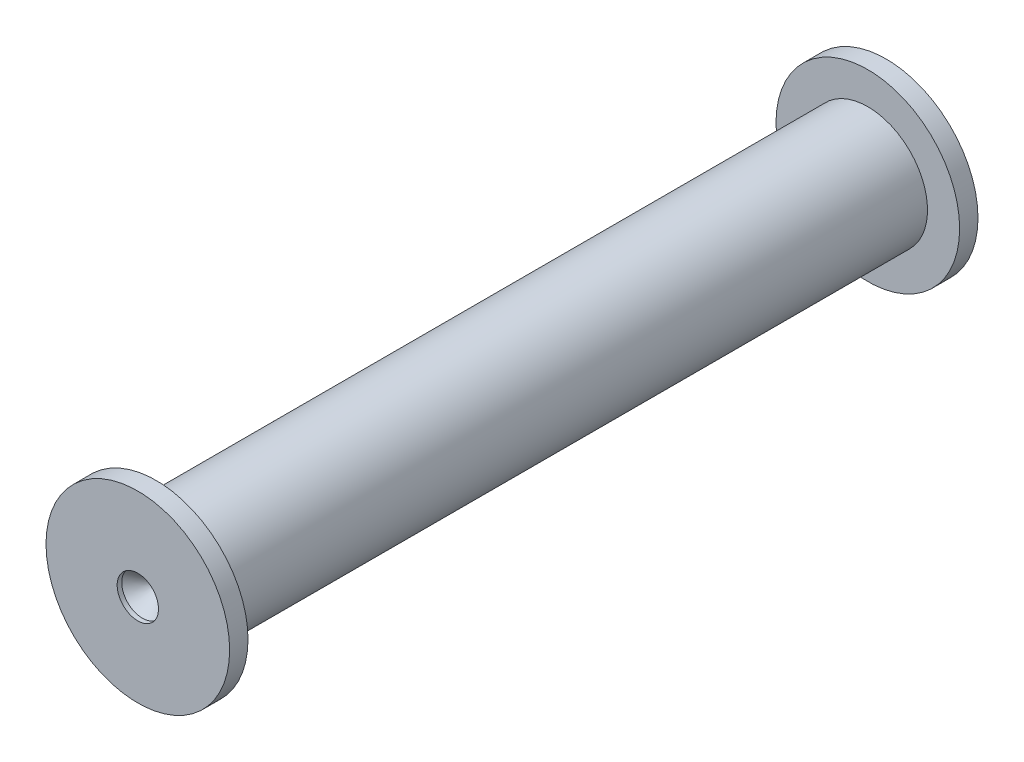
ISO-10303-21;
HEADER;
FILE_DESCRIPTION(('STEP AP214'),'2;1');
FILE_NAME('part.step','',(''),(''),'','','');
FILE_SCHEMA(('AUTOMOTIVE_DESIGN { 1 0 10303 214 1 1 1 1 }'));
ENDSEC;
DATA;
#1=APPLICATION_CONTEXT('core data for automotive mechanical design processes');
#2=APPLICATION_PROTOCOL_DEFINITION('international standard','automotive_design',2000,#1);
#3=PRODUCT_CONTEXT('',#1,'mechanical');
#4=PRODUCT('Part','Part','',(#3));
#5=PRODUCT_RELATED_PRODUCT_CATEGORY('part','',(#4));
#6=PRODUCT_DEFINITION_FORMATION('','',#4);
#7=PRODUCT_DEFINITION_CONTEXT('part definition',#1,'design');
#8=PRODUCT_DEFINITION('design','',#6,#7);
#9=PRODUCT_DEFINITION_SHAPE('','',#8);
#10=(LENGTH_UNIT() NAMED_UNIT(*) SI_UNIT(.MILLI.,.METRE.));
#11=(NAMED_UNIT(*) PLANE_ANGLE_UNIT() SI_UNIT($,.RADIAN.));
#12=(NAMED_UNIT(*) SI_UNIT($,.STERADIAN.) SOLID_ANGLE_UNIT());
#13=UNCERTAINTY_MEASURE_WITH_UNIT(LENGTH_MEASURE(1.E-05),#10,'distance_accuracy_value','');
#14=(GEOMETRIC_REPRESENTATION_CONTEXT(3) GLOBAL_UNCERTAINTY_ASSIGNED_CONTEXT((#13)) GLOBAL_UNIT_ASSIGNED_CONTEXT((#10,
#11,#12)) REPRESENTATION_CONTEXT('',''));
#15=CARTESIAN_POINT('',(0.,0.,0.));
#16=DIRECTION('',(0.,0.,1.));
#17=DIRECTION('',(1.,0.,0.));
#18=AXIS2_PLACEMENT_3D('',#15,#16,#17);
#19=CARTESIAN_POINT('',(3.3,-31.2819394424174,0.1));
#20=DIRECTION('',(0.,0.,-1.));
#21=DIRECTION('',(-1.,0.,0.));
#22=AXIS2_PLACEMENT_3D('',#19,#20,#21);
#23=CYLINDRICAL_SURFACE('',#22,1.3);
#24=CARTESIAN_POINT('',(3.3,-31.2819394424174,0.1));
#25=DIRECTION('',(0.,0.,1.));
#26=DIRECTION('',(1.,0.,0.));
#27=AXIS2_PLACEMENT_3D('',#24,#25,#26);
#28=CIRCLE('',#27,1.3);
#29=CARTESIAN_POINT('',(4.6,-31.2819394424174,0.1));
#30=VERTEX_POINT('',#29);
#31=EDGE_CURVE('E62',#30,#30,#28,.T.);
#32=ORIENTED_EDGE('',*,*,#31,.F.);
#33=EDGE_LOOP('',(#32));
#34=FACE_BOUND('',#33,.T.);
#35=CARTESIAN_POINT('',(3.3,-31.2819394424174,-15.4));
#36=DIRECTION('',(0.,0.,-1.));
#37=DIRECTION('',(-1.,0.,0.));
#38=AXIS2_PLACEMENT_3D('',#35,#36,#37);
#39=CIRCLE('',#38,1.3);
#40=CARTESIAN_POINT('',(2.,-31.2819394424174,-15.4));
#41=VERTEX_POINT('',#40);
#42=EDGE_CURVE('E69',#41,#41,#39,.T.);
#43=ORIENTED_EDGE('',*,*,#42,.F.);
#44=EDGE_LOOP('',(#43));
#45=FACE_BOUND('',#44,.T.);
#46=ADVANCED_FACE('F42',(#34,#45),#23,.T.);
#47=CARTESIAN_POINT('',(3.3,-31.2819394424174,0.1));
#48=DIRECTION('',(0.,0.,1.));
#49=DIRECTION('',(1.,0.,0.));
#50=AXIS2_PLACEMENT_3D('',#47,#48,#49);
#51=PLANE('',#50);
#52=CARTESIAN_POINT('',(3.3,-31.2819394424174,0.1));
#53=DIRECTION('',(0.,0.,1.));
#54=DIRECTION('',(1.,0.,0.));
#55=AXIS2_PLACEMENT_3D('',#52,#53,#54);
#56=CIRCLE('',#55,2.);
#57=CARTESIAN_POINT('',(5.3,-31.2819394424174,0.1));
#58=VERTEX_POINT('',#57);
#59=EDGE_CURVE('E66',#58,#58,#56,.T.);
#60=ORIENTED_EDGE('',*,*,#59,.F.);
#61=EDGE_LOOP('',(#60));
#62=FACE_BOUND('',#61,.T.);
#63=ORIENTED_EDGE('',*,*,#31,.T.);
#64=EDGE_LOOP('',(#63));
#65=FACE_BOUND('',#64,.T.);
#66=ADVANCED_FACE('F99',(#62,#65),#51,.F.);
#67=CARTESIAN_POINT('',(3.3,-31.2819394424174,0.5));
#68=DIRECTION('',(0.,0.,-1.));
#69=DIRECTION('',(-1.,0.,0.));
#70=AXIS2_PLACEMENT_3D('',#67,#68,#69);
#71=CYLINDRICAL_SURFACE('',#70,2.);
#72=CARTESIAN_POINT('',(3.3,-31.2819394424174,0.5));
#73=DIRECTION('',(0.,0.,1.));
#74=DIRECTION('',(1.,0.,0.));
#75=AXIS2_PLACEMENT_3D('',#72,#73,#74);
#76=CIRCLE('',#75,2.);
#77=CARTESIAN_POINT('',(5.3,-31.2819394424174,0.5));
#78=VERTEX_POINT('',#77);
#79=EDGE_CURVE('E65',#78,#78,#76,.T.);
#80=ORIENTED_EDGE('',*,*,#79,.F.);
#81=EDGE_LOOP('',(#80));
#82=FACE_BOUND('',#81,.T.);
#83=ORIENTED_EDGE('',*,*,#59,.T.);
#84=EDGE_LOOP('',(#83));
#85=FACE_BOUND('',#84,.T.);
#86=ADVANCED_FACE('F93',(#82,#85),#71,.T.);
#87=CARTESIAN_POINT('',(3.3,-31.2819394424174,0.5));
#88=DIRECTION('',(0.,0.,1.));
#89=DIRECTION('',(1.,0.,0.));
#90=AXIS2_PLACEMENT_3D('',#87,#88,#89);
#91=PLANE('',#90);
#92=CARTESIAN_POINT('',(3.3,-31.2819394424174,0.5));
#93=DIRECTION('',(0.,0.,1.));
#94=DIRECTION('',(1.,0.,0.));
#95=AXIS2_PLACEMENT_3D('',#92,#93,#94);
#96=CIRCLE('',#95,0.449999999999999);
#97=CARTESIAN_POINT('',(3.75,-31.2819394424174,0.5));
#98=VERTEX_POINT('',#97);
#99=EDGE_CURVE('E83',#98,#98,#96,.T.);
#100=ORIENTED_EDGE('',*,*,#99,.F.);
#101=EDGE_LOOP('',(#100));
#102=FACE_BOUND('',#101,.T.);
#103=ORIENTED_EDGE('',*,*,#79,.T.);
#104=EDGE_LOOP('',(#103));
#105=FACE_BOUND('',#104,.T.);
#106=ADVANCED_FACE('F89',(#102,#105),#91,.T.);
#107=CARTESIAN_POINT('',(3.3,-31.2819394424174,-15.4));
#108=DIRECTION('',(0.,0.,-1.));
#109=DIRECTION('',(-1.,0.,0.));
#110=AXIS2_PLACEMENT_3D('',#107,#108,#109);
#111=PLANE('',#110);
#112=CARTESIAN_POINT('',(3.3,-31.2819394424174,-15.4));
#113=DIRECTION('',(0.,0.,-1.));
#114=DIRECTION('',(-1.,0.,0.));
#115=AXIS2_PLACEMENT_3D('',#112,#113,#114);
#116=CIRCLE('',#115,2.);
#117=CARTESIAN_POINT('',(1.3,-31.2819394424174,-15.4));
#118=VERTEX_POINT('',#117);
#119=EDGE_CURVE('E75',#118,#118,#116,.T.);
#120=ORIENTED_EDGE('',*,*,#119,.F.);
#121=EDGE_LOOP('',(#120));
#122=FACE_BOUND('',#121,.T.);
#123=ORIENTED_EDGE('',*,*,#42,.T.);
#124=EDGE_LOOP('',(#123));
#125=FACE_BOUND('',#124,.T.);
#126=ADVANCED_FACE('F92',(#122,#125),#111,.F.);
#127=CARTESIAN_POINT('',(3.3,-31.2819394424174,-15.8));
#128=DIRECTION('',(0.,0.,1.));
#129=DIRECTION('',(1.,0.,0.));
#130=AXIS2_PLACEMENT_3D('',#127,#128,#129);
#131=CYLINDRICAL_SURFACE('',#130,2.);
#132=CARTESIAN_POINT('',(3.3,-31.2819394424174,-15.8));
#133=DIRECTION('',(0.,0.,-1.));
#134=DIRECTION('',(-1.,0.,0.));
#135=AXIS2_PLACEMENT_3D('',#132,#133,#134);
#136=CIRCLE('',#135,2.);
#137=CARTESIAN_POINT('',(1.3,-31.2819394424174,-15.8));
#138=VERTEX_POINT('',#137);
#139=EDGE_CURVE('E74',#138,#138,#136,.T.);
#140=ORIENTED_EDGE('',*,*,#139,.F.);
#141=EDGE_LOOP('',(#140));
#142=FACE_BOUND('',#141,.T.);
#143=ORIENTED_EDGE('',*,*,#119,.T.);
#144=EDGE_LOOP('',(#143));
#145=FACE_BOUND('',#144,.T.);
#146=ADVANCED_FACE('F114',(#142,#145),#131,.T.);
#147=CARTESIAN_POINT('',(3.3,-31.2819394424174,-15.8));
#148=DIRECTION('',(0.,0.,-1.));
#149=DIRECTION('',(-1.,0.,0.));
#150=AXIS2_PLACEMENT_3D('',#147,#148,#149);
#151=PLANE('',#150);
#152=CARTESIAN_POINT('',(3.3,-31.2819394424174,-15.8));
#153=DIRECTION('',(0.,0.,-1.));
#154=DIRECTION('',(-1.,0.,0.));
#155=AXIS2_PLACEMENT_3D('',#152,#153,#154);
#156=CIRCLE('',#155,0.449999999999999);
#157=CARTESIAN_POINT('',(2.85,-31.2819394424174,-15.8));
#158=VERTEX_POINT('',#157);
#159=EDGE_CURVE('E78',#158,#158,#156,.T.);
#160=ORIENTED_EDGE('',*,*,#159,.F.);
#161=EDGE_LOOP('',(#160));
#162=FACE_BOUND('',#161,.T.);
#163=ORIENTED_EDGE('',*,*,#139,.T.);
#164=EDGE_LOOP('',(#163));
#165=FACE_BOUND('',#164,.T.);
#166=ADVANCED_FACE('F120',(#162,#165),#151,.T.);
#167=CARTESIAN_POINT('',(3.3,-31.2819394424174,-15.3));
#168=DIRECTION('',(0.,0.,-1.));
#169=DIRECTION('',(-1.,0.,0.));
#170=AXIS2_PLACEMENT_3D('',#167,#168,#169);
#171=CYLINDRICAL_SURFACE('',#170,0.449999999999999);
#172=CARTESIAN_POINT('',(3.3,-31.2819394424174,-15.7));
#173=DIRECTION('',(0.,0.,-1.));
#174=DIRECTION('',(-1.,0.,0.));
#175=AXIS2_PLACEMENT_3D('',#172,#173,#174);
#176=CIRCLE('',#175,0.449999999999999);
#177=CARTESIAN_POINT('',(2.85,-31.2819394424174,-15.7));
#178=VERTEX_POINT('',#177);
#179=EDGE_CURVE('E53',#178,#178,#176,.F.);
#180=ORIENTED_EDGE('',*,*,#179,.T.);
#181=EDGE_LOOP('',(#180));
#182=FACE_BOUND('',#181,.T.);
#183=ORIENTED_EDGE('',*,*,#159,.T.);
#184=EDGE_LOOP('',(#183));
#185=FACE_BOUND('',#184,.T.);
#186=ADVANCED_FACE('F136',(#182,#185),#171,.F.);
#187=CARTESIAN_POINT('',(3.3,-31.2819394424174,-15.3));
#188=DIRECTION('',(0.,0.,-1.));
#189=DIRECTION('',(-1.,0.,0.));
#190=AXIS2_PLACEMENT_3D('',#187,#188,#189);
#191=PLANE('',#190);
#192=CARTESIAN_POINT('',(3.3,-31.2819394424174,-15.3));
#193=DIRECTION('',(0.,0.,-1.));
#194=DIRECTION('',(-1.,0.,0.));
#195=AXIS2_PLACEMENT_3D('',#192,#193,#194);
#196=CIRCLE('',#195,0.0499999999999928);
#197=CARTESIAN_POINT('',(3.25000000000001,-31.2819394424174,-15.3));
#198=VERTEX_POINT('',#197);
#199=EDGE_CURVE('E57',#198,#198,#196,.T.);
#200=ORIENTED_EDGE('',*,*,#199,.T.);
#201=EDGE_LOOP('',(#200));
#202=FACE_BOUND('',#201,.T.);
#203=ADVANCED_FACE('F128',(#202),#191,.T.);
#204=CARTESIAN_POINT('',(3.3,-31.2819394424174,-15.3));
#205=DIRECTION('',(0.,0.,-1.));
#206=DIRECTION('',(-1.,0.,0.));
#207=AXIS2_PLACEMENT_3D('',#204,#205,#206);
#208=CONICAL_SURFACE('',#207,0.0499999999999928,0.785398163397455);
#209=CARTESIAN_POINT('',(2.85,-31.2819394424174,-15.7));
#210=CARTESIAN_POINT('',(2.85416666666667,-31.2819394424174,-15.6958333333333));
#211=CARTESIAN_POINT('',(2.85833333333334,-31.2819394424174,-15.6916666666667));
#212=CARTESIAN_POINT('',(2.86666666666667,-31.2819394424174,-15.6833333333333));
#213=CARTESIAN_POINT('',(2.87083333333334,-31.2819394424174,-15.6791666666667));
#214=CARTESIAN_POINT('',(2.87916666666667,-31.2819394424174,-15.6708333333333));
#215=CARTESIAN_POINT('',(2.88333333333334,-31.2819394424174,-15.6666666666667));
#216=CARTESIAN_POINT('',(2.89166666666667,-31.2819394424174,-15.6583333333333));
#217=CARTESIAN_POINT('',(2.89583333333334,-31.2819394424174,-15.6541666666667));
#218=CARTESIAN_POINT('',(2.90416666666667,-31.2819394424174,-15.6458333333333));
#219=CARTESIAN_POINT('',(2.90833333333334,-31.2819394424174,-15.6416666666667));
#220=CARTESIAN_POINT('',(2.91666666666667,-31.2819394424174,-15.6333333333333));
#221=CARTESIAN_POINT('',(2.92083333333334,-31.2819394424174,-15.6291666666667));
#222=CARTESIAN_POINT('',(2.92916666666667,-31.2819394424174,-15.6208333333333));
#223=CARTESIAN_POINT('',(2.93333333333334,-31.2819394424174,-15.6166666666667));
#224=CARTESIAN_POINT('',(2.94166666666667,-31.2819394424174,-15.6083333333333));
#225=CARTESIAN_POINT('',(2.94583333333334,-31.2819394424174,-15.6041666666667));
#226=CARTESIAN_POINT('',(2.95416666666667,-31.2819394424174,-15.5958333333333));
#227=CARTESIAN_POINT('',(2.95833333333334,-31.2819394424174,-15.5916666666667));
#228=CARTESIAN_POINT('',(2.96666666666667,-31.2819394424174,-15.5833333333333));
#229=CARTESIAN_POINT('',(2.97083333333334,-31.2819394424174,-15.5791666666667));
#230=CARTESIAN_POINT('',(2.97916666666667,-31.2819394424174,-15.5708333333333));
#231=CARTESIAN_POINT('',(2.98333333333334,-31.2819394424174,-15.5666666666667));
#232=CARTESIAN_POINT('',(2.99166666666667,-31.2819394424174,-15.5583333333333));
#233=CARTESIAN_POINT('',(2.99583333333334,-31.2819394424174,-15.5541666666667));
#234=CARTESIAN_POINT('',(3.00416666666667,-31.2819394424174,-15.5458333333333));
#235=CARTESIAN_POINT('',(3.00833333333334,-31.2819394424174,-15.5416666666667));
#236=CARTESIAN_POINT('',(3.01666666666667,-31.2819394424174,-15.5333333333333));
#237=CARTESIAN_POINT('',(3.02083333333334,-31.2819394424174,-15.5291666666667));
#238=CARTESIAN_POINT('',(3.02916666666667,-31.2819394424174,-15.5208333333333));
#239=CARTESIAN_POINT('',(3.03333333333334,-31.2819394424174,-15.5166666666667));
#240=CARTESIAN_POINT('',(3.04166666666667,-31.2819394424174,-15.5083333333333));
#241=CARTESIAN_POINT('',(3.04583333333334,-31.2819394424174,-15.5041666666667));
#242=CARTESIAN_POINT('',(3.05416666666667,-31.2819394424174,-15.4958333333333));
#243=CARTESIAN_POINT('',(3.05833333333334,-31.2819394424174,-15.4916666666667));
#244=CARTESIAN_POINT('',(3.06666666666667,-31.2819394424174,-15.4833333333333));
#245=CARTESIAN_POINT('',(3.07083333333334,-31.2819394424174,-15.4791666666667));
#246=CARTESIAN_POINT('',(3.07916666666667,-31.2819394424174,-15.4708333333333));
#247=CARTESIAN_POINT('',(3.08333333333334,-31.2819394424174,-15.4666666666667));
#248=CARTESIAN_POINT('',(3.09166666666667,-31.2819394424174,-15.4583333333333));
#249=CARTESIAN_POINT('',(3.09583333333334,-31.2819394424174,-15.4541666666667));
#250=CARTESIAN_POINT('',(3.10416666666667,-31.2819394424174,-15.4458333333333));
#251=CARTESIAN_POINT('',(3.10833333333334,-31.2819394424174,-15.4416666666667));
#252=CARTESIAN_POINT('',(3.11666666666667,-31.2819394424174,-15.4333333333333));
#253=CARTESIAN_POINT('',(3.12083333333334,-31.2819394424174,-15.4291666666667));
#254=CARTESIAN_POINT('',(3.12916666666667,-31.2819394424174,-15.4208333333333));
#255=CARTESIAN_POINT('',(3.13333333333334,-31.2819394424174,-15.4166666666667));
#256=CARTESIAN_POINT('',(3.14166666666667,-31.2819394424174,-15.4083333333333));
#257=CARTESIAN_POINT('',(3.14583333333334,-31.2819394424174,-15.4041666666667));
#258=CARTESIAN_POINT('',(3.15416666666667,-31.2819394424174,-15.3958333333333));
#259=CARTESIAN_POINT('',(3.15833333333334,-31.2819394424174,-15.3916666666667));
#260=CARTESIAN_POINT('',(3.16666666666667,-31.2819394424174,-15.3833333333333));
#261=CARTESIAN_POINT('',(3.17083333333334,-31.2819394424174,-15.3791666666667));
#262=CARTESIAN_POINT('',(3.17916666666667,-31.2819394424174,-15.3708333333333));
#263=CARTESIAN_POINT('',(3.18333333333334,-31.2819394424174,-15.3666666666667));
#264=CARTESIAN_POINT('',(3.19166666666667,-31.2819394424174,-15.3583333333333));
#265=CARTESIAN_POINT('',(3.19583333333334,-31.2819394424174,-15.3541666666667));
#266=CARTESIAN_POINT('',(3.20416666666667,-31.2819394424174,-15.3458333333333));
#267=CARTESIAN_POINT('',(3.20833333333334,-31.2819394424174,-15.3416666666667));
#268=CARTESIAN_POINT('',(3.21666666666667,-31.2819394424174,-15.3333333333333));
#269=CARTESIAN_POINT('',(3.22083333333334,-31.2819394424174,-15.3291666666667));
#270=CARTESIAN_POINT('',(3.22916666666667,-31.2819394424174,-15.3208333333333));
#271=CARTESIAN_POINT('',(3.23333333333334,-31.2819394424174,-15.3166666666667));
#272=CARTESIAN_POINT('',(3.24166666666667,-31.2819394424174,-15.3083333333333));
#273=CARTESIAN_POINT('',(3.24583333333334,-31.2819394424174,-15.3041666666667));
#274=CARTESIAN_POINT('',(3.25000000000001,-31.2819394424174,-15.3));
#275=B_SPLINE_CURVE_WITH_KNOTS('',3,(#209,#210,#211,#212,#213,#214,#215,#216,#217,#218,#219,
#220,#221,#222,#223,#224,#225,#226,#227,#228,#229,#230,#231,#232,#233,#234,#235,#236,#237,#238,
#239,#240,#241,#242,#243,#244,#245,#246,#247,#248,#249,#250,#251,#252,#253,#254,#255,#256,#257,
#258,#259,#260,#261,#262,#263,#264,#265,#266,#267,#268,#269,#270,#271,#272,#273,#274),
.UNSPECIFIED.,.F.,.F.,(4,2,2,2,2,2,2,2,2,2,2,2,2,2,2,2,2,2,2,2,2,2,2,2,2,2,2,2,2,2,2,2,4),(0.,
0.017677669529663,0.0353553390593256,0.053033008588991,0.0707106781186537,0.0883883476483191,
0.106066017177982,0.123743686707646,0.141421356237309,0.159099025766973,0.176776695296637,
0.194454364826301,0.212132034355965,0.229809703885628,0.247487373415292,0.265165042944956,
0.28284271247462,0.300520382004284,0.318198051533947,0.335875721063611,0.353553390593275,
0.371231060122939,0.388908729652603,0.406586399182266,0.42426406871193,0.441941738241594,
0.459619407771258,0.477297077300921,0.494974746830585,0.512652416360249,0.530330085889913,
0.548007755419577,0.56568542494924),.UNSPECIFIED.);
#276=EDGE_CURVE('BSEAM126',#178,#198,#275,.T.);
#277=ORIENTED_EDGE('',*,*,#179,.F.);
#278=ORIENTED_EDGE('',*,*,#199,.F.);
#279=ORIENTED_EDGE('',*,*,#276,.T.);
#280=ORIENTED_EDGE('',*,*,#276,.F.);
#281=EDGE_LOOP('',(#277,#279,#278,#280));
#282=FACE_BOUND('',#281,.T.);
#283=ADVANCED_FACE('F126',(#282),#208,.F.);
#284=CARTESIAN_POINT('',(3.3,-31.2819394424174,0.));
#285=DIRECTION('',(0.,0.,1.));
#286=DIRECTION('',(1.,0.,0.));
#287=AXIS2_PLACEMENT_3D('',#284,#285,#286);
#288=CYLINDRICAL_SURFACE('',#287,0.449999999999999);
#289=CARTESIAN_POINT('',(3.3,-31.2819394424174,0.399999999999997));
#290=DIRECTION('',(0.,0.,1.));
#291=DIRECTION('',(1.,0.,0.));
#292=AXIS2_PLACEMENT_3D('',#289,#290,#291);
#293=CIRCLE('',#292,0.449999999999999);
#294=CARTESIAN_POINT('',(3.75,-31.2819394424174,0.399999999999997));
#295=VERTEX_POINT('',#294);
#296=EDGE_CURVE('E12',#295,#295,#293,.F.);
#297=ORIENTED_EDGE('',*,*,#296,.T.);
#298=EDGE_LOOP('',(#297));
#299=FACE_BOUND('',#298,.T.);
#300=ORIENTED_EDGE('',*,*,#99,.T.);
#301=EDGE_LOOP('',(#300));
#302=FACE_BOUND('',#301,.T.);
#303=ADVANCED_FACE('F87',(#299,#302),#288,.F.);
#304=CARTESIAN_POINT('',(3.3,-31.2819394424174,0.));
#305=DIRECTION('',(0.,0.,1.));
#306=DIRECTION('',(1.,0.,0.));
#307=AXIS2_PLACEMENT_3D('',#304,#305,#306);
#308=PLANE('',#307);
#309=CARTESIAN_POINT('',(3.3,-31.2819394424174,0.));
#310=DIRECTION('',(0.,0.,1.));
#311=DIRECTION('',(1.,0.,0.));
#312=AXIS2_PLACEMENT_3D('',#309,#310,#311);
#313=CIRCLE('',#312,0.0499999999999997);
#314=CARTESIAN_POINT('',(3.35,-31.2819394424174,0.));
#315=VERTEX_POINT('',#314);
#316=EDGE_CURVE('E49',#315,#315,#313,.T.);
#317=ORIENTED_EDGE('',*,*,#316,.T.);
#318=EDGE_LOOP('',(#317));
#319=FACE_BOUND('',#318,.T.);
#320=ADVANCED_FACE('F134',(#319),#308,.T.);
#321=CARTESIAN_POINT('',(3.3,-31.2819394424174,0.));
#322=DIRECTION('',(0.,0.,1.));
#323=DIRECTION('',(1.,0.,0.));
#324=AXIS2_PLACEMENT_3D('',#321,#322,#323);
#325=CONICAL_SURFACE('',#324,0.0499999999999997,0.785398163397452);
#326=CARTESIAN_POINT('',(3.75,-31.2819394424174,0.399999999999997));
#327=CARTESIAN_POINT('',(3.74583333333333,-31.2819394424174,0.39583333333333));
#328=CARTESIAN_POINT('',(3.74166666666667,-31.2819394424174,0.391666666666664));
#329=CARTESIAN_POINT('',(3.73333333333333,-31.2819394424174,0.38333333333333));
#330=CARTESIAN_POINT('',(3.72916666666667,-31.2819394424174,0.379166666666664));
#331=CARTESIAN_POINT('',(3.72083333333333,-31.2819394424174,0.37083333333333));
#332=CARTESIAN_POINT('',(3.71666666666667,-31.2819394424174,0.366666666666664));
#333=CARTESIAN_POINT('',(3.70833333333333,-31.2819394424174,0.358333333333331));
#334=CARTESIAN_POINT('',(3.70416666666667,-31.2819394424174,0.354166666666664));
#335=CARTESIAN_POINT('',(3.69583333333333,-31.2819394424174,0.345833333333331));
#336=CARTESIAN_POINT('',(3.69166666666667,-31.2819394424174,0.341666666666664));
#337=CARTESIAN_POINT('',(3.68333333333333,-31.2819394424174,0.333333333333331));
#338=CARTESIAN_POINT('',(3.67916666666667,-31.2819394424174,0.329166666666664));
#339=CARTESIAN_POINT('',(3.67083333333333,-31.2819394424174,0.320833333333331));
#340=CARTESIAN_POINT('',(3.66666666666667,-31.2819394424174,0.316666666666664));
#341=CARTESIAN_POINT('',(3.65833333333333,-31.2819394424174,0.308333333333331));
#342=CARTESIAN_POINT('',(3.65416666666667,-31.2819394424174,0.304166666666664));
#343=CARTESIAN_POINT('',(3.64583333333333,-31.2819394424174,0.295833333333331));
#344=CARTESIAN_POINT('',(3.64166666666667,-31.2819394424174,0.291666666666664));
#345=CARTESIAN_POINT('',(3.63333333333333,-31.2819394424174,0.283333333333331));
#346=CARTESIAN_POINT('',(3.62916666666667,-31.2819394424174,0.279166666666664));
#347=CARTESIAN_POINT('',(3.62083333333333,-31.2819394424174,0.270833333333331));
#348=CARTESIAN_POINT('',(3.61666666666667,-31.2819394424174,0.266666666666665));
#349=CARTESIAN_POINT('',(3.60833333333333,-31.2819394424174,0.258333333333331));
#350=CARTESIAN_POINT('',(3.60416666666667,-31.2819394424174,0.254166666666665));
#351=CARTESIAN_POINT('',(3.59583333333333,-31.2819394424174,0.245833333333331));
#352=CARTESIAN_POINT('',(3.59166666666667,-31.2819394424174,0.241666666666665));
#353=CARTESIAN_POINT('',(3.58333333333333,-31.2819394424174,0.233333333333331));
#354=CARTESIAN_POINT('',(3.57916666666667,-31.2819394424174,0.229166666666665));
#355=CARTESIAN_POINT('',(3.57083333333333,-31.2819394424174,0.220833333333332));
#356=CARTESIAN_POINT('',(3.56666666666667,-31.2819394424174,0.216666666666665));
#357=CARTESIAN_POINT('',(3.55833333333333,-31.2819394424174,0.208333333333332));
#358=CARTESIAN_POINT('',(3.55416666666667,-31.2819394424174,0.204166666666665));
#359=CARTESIAN_POINT('',(3.54583333333333,-31.2819394424174,0.195833333333332));
#360=CARTESIAN_POINT('',(3.54166666666667,-31.2819394424174,0.191666666666665));
#361=CARTESIAN_POINT('',(3.53333333333333,-31.2819394424174,0.183333333333332));
#362=CARTESIAN_POINT('',(3.52916666666667,-31.2819394424174,0.179166666666665));
#363=CARTESIAN_POINT('',(3.52083333333333,-31.2819394424174,0.170833333333332));
#364=CARTESIAN_POINT('',(3.51666666666667,-31.2819394424174,0.166666666666665));
#365=CARTESIAN_POINT('',(3.50833333333333,-31.2819394424174,0.158333333333332));
#366=CARTESIAN_POINT('',(3.50416666666667,-31.2819394424174,0.154166666666665));
#367=CARTESIAN_POINT('',(3.49583333333333,-31.2819394424174,0.145833333333332));
#368=CARTESIAN_POINT('',(3.49166666666667,-31.2819394424174,0.141666666666666));
#369=CARTESIAN_POINT('',(3.48333333333333,-31.2819394424174,0.133333333333332));
#370=CARTESIAN_POINT('',(3.47916666666667,-31.2819394424174,0.129166666666666));
#371=CARTESIAN_POINT('',(3.47083333333333,-31.2819394424174,0.120833333333332));
#372=CARTESIAN_POINT('',(3.46666666666667,-31.2819394424174,0.116666666666666));
#373=CARTESIAN_POINT('',(3.45833333333333,-31.2819394424174,0.108333333333333));
#374=CARTESIAN_POINT('',(3.45416666666667,-31.2819394424174,0.104166666666666));
#375=CARTESIAN_POINT('',(3.44583333333333,-31.2819394424174,0.0958333333333325));
#376=CARTESIAN_POINT('',(3.44166666666667,-31.2819394424174,0.0916666666666659));
#377=CARTESIAN_POINT('',(3.43333333333333,-31.2819394424174,0.0833333333333327));
#378=CARTESIAN_POINT('',(3.42916666666667,-31.2819394424174,0.079166666666666));
#379=CARTESIAN_POINT('',(3.42083333333333,-31.2819394424174,0.0708333333333328));
#380=CARTESIAN_POINT('',(3.41666666666667,-31.2819394424174,0.0666666666666662));
#381=CARTESIAN_POINT('',(3.40833333333333,-31.2819394424174,0.0583333333333329));
#382=CARTESIAN_POINT('',(3.40416666666667,-31.2819394424174,0.0541666666666662));
#383=CARTESIAN_POINT('',(3.39583333333333,-31.2819394424174,0.0458333333333329));
#384=CARTESIAN_POINT('',(3.39166666666667,-31.2819394424174,0.0416666666666664));
#385=CARTESIAN_POINT('',(3.38333333333333,-31.2819394424174,0.0333333333333331));
#386=CARTESIAN_POINT('',(3.37916666666667,-31.2819394424174,0.0291666666666664));
#387=CARTESIAN_POINT('',(3.37083333333333,-31.2819394424174,0.0208333333333332));
#388=CARTESIAN_POINT('',(3.36666666666667,-31.2819394424174,0.0166666666666665));
#389=CARTESIAN_POINT('',(3.35833333333333,-31.2819394424174,0.0083333333333333));
#390=CARTESIAN_POINT('',(3.35416666666667,-31.2819394424174,0.00416666666666666));
#391=CARTESIAN_POINT('',(3.35,-31.2819394424174,0.));
#392=B_SPLINE_CURVE_WITH_KNOTS('',3,(#326,#327,#328,#329,#330,#331,#332,#333,#334,#335,#336,
#337,#338,#339,#340,#341,#342,#343,#344,#345,#346,#347,#348,#349,#350,#351,#352,#353,#354,#355,
#356,#357,#358,#359,#360,#361,#362,#363,#364,#365,#366,#367,#368,#369,#370,#371,#372,#373,#374,
#375,#376,#377,#378,#379,#380,#381,#382,#383,#384,#385,#386,#387,#388,#389,#390,#391),
.UNSPECIFIED.,.F.,.F.,(4,2,2,2,2,2,2,2,2,2,2,2,2,2,2,2,2,2,2,2,2,2,2,2,2,2,2,2,2,2,2,2,4),(0.,
0.0176776695296636,0.0353553390593271,0.053033008588991,0.0707106781186546,0.0883883476483181,
0.106066017177982,0.123743686707645,0.141421356237309,0.159099025766972,0.176776695296636,
0.1944543648263,0.212132034355963,0.229809703885627,0.247487373415291,0.265165042944954,
0.282842712474618,0.300520382004281,0.318198051533945,0.335875721063609,0.353553390593272,
0.371231060122936,0.388908729652599,0.406586399182263,0.424264068711927,0.44194173824159,
0.459619407771254,0.477297077300917,0.494974746830581,0.512652416360245,0.530330085889908,
0.548007755419572,0.565685424949236),.UNSPECIFIED.);
#393=EDGE_CURVE('BSEAM44',#295,#315,#392,.T.);
#394=ORIENTED_EDGE('',*,*,#296,.F.);
#395=ORIENTED_EDGE('',*,*,#316,.F.);
#396=ORIENTED_EDGE('',*,*,#393,.T.);
#397=ORIENTED_EDGE('',*,*,#393,.F.);
#398=EDGE_LOOP('',(#394,#396,#395,#397));
#399=FACE_BOUND('',#398,.T.);
#400=ADVANCED_FACE('F44',(#399),#325,.F.);
#401=CLOSED_SHELL('',(#46,#66,#86,#106,#126,#146,#166,#186,#203,#283,#303,#320,#400));
#402=MANIFOLD_SOLID_BREP('B2',#401);
#403=ADVANCED_BREP_SHAPE_REPRESENTATION('',(#18,#402),#14);
#404=SHAPE_DEFINITION_REPRESENTATION(#9,#403);
ENDSEC;
END-ISO-10303-21;
